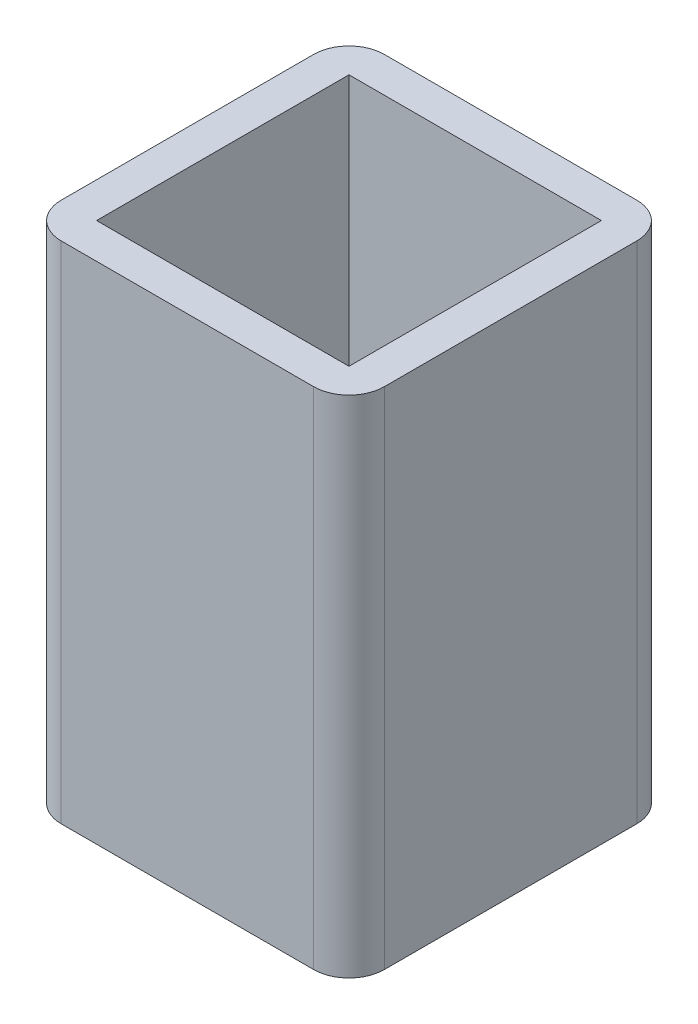
ISO-10303-21;
HEADER;
FILE_DESCRIPTION(('STEP AP214'),'2;1');
FILE_NAME('part.step','',(''),(''),'','','');
FILE_SCHEMA(('AUTOMOTIVE_DESIGN { 1 0 10303 214 1 1 1 1 }'));
ENDSEC;
DATA;
#1=APPLICATION_CONTEXT('core data for automotive mechanical design processes');
#2=APPLICATION_PROTOCOL_DEFINITION('international standard','automotive_design',2000,#1);
#3=PRODUCT_CONTEXT('',#1,'mechanical');
#4=PRODUCT('Part','Part','',(#3));
#5=PRODUCT_RELATED_PRODUCT_CATEGORY('part','',(#4));
#6=PRODUCT_DEFINITION_FORMATION('','',#4);
#7=PRODUCT_DEFINITION_CONTEXT('part definition',#1,'design');
#8=PRODUCT_DEFINITION('design','',#6,#7);
#9=PRODUCT_DEFINITION_SHAPE('','',#8);
#10=(LENGTH_UNIT() NAMED_UNIT(*) SI_UNIT(.MILLI.,.METRE.));
#11=(NAMED_UNIT(*) PLANE_ANGLE_UNIT() SI_UNIT($,.RADIAN.));
#12=(NAMED_UNIT(*) SI_UNIT($,.STERADIAN.) SOLID_ANGLE_UNIT());
#13=UNCERTAINTY_MEASURE_WITH_UNIT(LENGTH_MEASURE(1.E-05),#10,'distance_accuracy_value','');
#14=(GEOMETRIC_REPRESENTATION_CONTEXT(3) GLOBAL_UNCERTAINTY_ASSIGNED_CONTEXT((#13)) GLOBAL_UNIT_ASSIGNED_CONTEXT((#10,
#11,#12)) REPRESENTATION_CONTEXT('',''));
#15=CARTESIAN_POINT('',(0.,0.,0.));
#16=DIRECTION('',(0.,0.,1.));
#17=DIRECTION('',(1.,0.,0.));
#18=AXIS2_PLACEMENT_3D('',#15,#16,#17);
#19=CARTESIAN_POINT('',(22.8,40.,2.8));
#20=DIRECTION('',(0.,-1.,0.));
#21=DIRECTION('',(0.,0.,-1.));
#22=AXIS2_PLACEMENT_3D('',#19,#20,#21);
#23=CYLINDRICAL_SURFACE('',#22,2.8);
#24=CARTESIAN_POINT('',(22.8,0.,2.8));
#25=DIRECTION('',(0.,1.,0.));
#26=DIRECTION('',(0.,0.,-1.));
#27=AXIS2_PLACEMENT_3D('',#24,#25,#26);
#28=CIRCLE('',#27,2.8);
#29=CARTESIAN_POINT('',(25.6,0.,2.80000000000002));
#30=VERTEX_POINT('',#29);
#31=CARTESIAN_POINT('',(22.8,0.,0.));
#32=VERTEX_POINT('',#31);
#33=EDGE_CURVE('E157',#30,#32,#28,.T.);
#34=ORIENTED_EDGE('',*,*,#33,.T.);
#35=DIRECTION('',(0.,-1.,0.));
#36=VECTOR('',#35,1.);
#37=CARTESIAN_POINT('',(22.8,40.,0.));
#38=LINE('',#37,#36);
#39=CARTESIAN_POINT('',(22.8,40.,0.));
#40=VERTEX_POINT('',#39);
#41=EDGE_CURVE('E11',#40,#32,#38,.T.);
#42=ORIENTED_EDGE('',*,*,#41,.F.);
#43=CARTESIAN_POINT('',(22.8,40.,2.8));
#44=DIRECTION('',(0.,1.,0.));
#45=DIRECTION('',(0.,0.,-1.));
#46=AXIS2_PLACEMENT_3D('',#43,#44,#45);
#47=CIRCLE('',#46,2.8);
#48=CARTESIAN_POINT('',(25.6,40.,2.80000000000002));
#49=VERTEX_POINT('',#48);
#50=EDGE_CURVE('E158',#49,#40,#47,.T.);
#51=ORIENTED_EDGE('',*,*,#50,.F.);
#52=DIRECTION('',(0.,-1.,0.));
#53=VECTOR('',#52,1.);
#54=CARTESIAN_POINT('',(25.6,40.,2.80000000000002));
#55=LINE('',#54,#53);
#56=EDGE_CURVE('E176',#49,#30,#55,.T.);
#57=ORIENTED_EDGE('',*,*,#56,.T.);
#58=EDGE_LOOP('',(#34,#42,#51,#57));
#59=FACE_BOUND('',#58,.T.);
#60=ADVANCED_FACE('F32',(#59),#23,.T.);
#61=CARTESIAN_POINT('',(2.80000000000002,40.,0.));
#62=DIRECTION('',(0.,0.,1.));
#63=DIRECTION('',(1.,0.,0.));
#64=AXIS2_PLACEMENT_3D('',#61,#62,#63);
#65=PLANE('',#64);
#66=DIRECTION('',(-1.,0.,0.));
#67=VECTOR('',#66,1.);
#68=CARTESIAN_POINT('',(2.80000000000002,0.,0.));
#69=LINE('',#68,#67);
#70=CARTESIAN_POINT('',(2.80000000000002,0.,0.));
#71=VERTEX_POINT('',#70);
#72=EDGE_CURVE('E179',#32,#71,#69,.T.);
#73=ORIENTED_EDGE('',*,*,#72,.T.);
#74=DIRECTION('',(0.,-1.,0.));
#75=VECTOR('',#74,1.);
#76=CARTESIAN_POINT('',(2.80000000000002,40.,0.));
#77=LINE('',#76,#75);
#78=CARTESIAN_POINT('',(2.80000000000002,40.,0.));
#79=VERTEX_POINT('',#78);
#80=EDGE_CURVE('E39',#79,#71,#77,.T.);
#81=ORIENTED_EDGE('',*,*,#80,.F.);
#82=DIRECTION('',(-1.,0.,0.));
#83=VECTOR('',#82,1.);
#84=CARTESIAN_POINT('',(2.80000000000002,40.,0.));
#85=LINE('',#84,#83);
#86=EDGE_CURVE('E161',#40,#79,#85,.T.);
#87=ORIENTED_EDGE('',*,*,#86,.F.);
#88=ORIENTED_EDGE('',*,*,#41,.T.);
#89=EDGE_LOOP('',(#73,#81,#87,#88));
#90=FACE_BOUND('',#89,.T.);
#91=ADVANCED_FACE('F234',(#90),#65,.F.);
#92=CARTESIAN_POINT('',(2.8,40.,2.8));
#93=DIRECTION('',(0.,-1.,0.));
#94=DIRECTION('',(0.,0.,-1.));
#95=AXIS2_PLACEMENT_3D('',#92,#93,#94);
#96=CYLINDRICAL_SURFACE('',#95,2.8);
#97=CARTESIAN_POINT('',(2.8,0.,2.8));
#98=DIRECTION('',(0.,1.,0.));
#99=DIRECTION('',(0.,0.,1.));
#100=AXIS2_PLACEMENT_3D('',#97,#98,#99);
#101=CIRCLE('',#100,2.8);
#102=CARTESIAN_POINT('',(0.,0.,2.80000000000002));
#103=VERTEX_POINT('',#102);
#104=EDGE_CURVE('E181',#71,#103,#101,.T.);
#105=ORIENTED_EDGE('',*,*,#104,.T.);
#106=DIRECTION('',(0.,-1.,0.));
#107=VECTOR('',#106,1.);
#108=CARTESIAN_POINT('',(0.,40.,2.80000000000002));
#109=LINE('',#108,#107);
#110=CARTESIAN_POINT('',(0.,40.,2.80000000000002));
#111=VERTEX_POINT('',#110);
#112=EDGE_CURVE('E206',#111,#103,#109,.T.);
#113=ORIENTED_EDGE('',*,*,#112,.F.);
#114=CARTESIAN_POINT('',(2.8,40.,2.8));
#115=DIRECTION('',(0.,1.,0.));
#116=DIRECTION('',(0.,0.,1.));
#117=AXIS2_PLACEMENT_3D('',#114,#115,#116);
#118=CIRCLE('',#117,2.8);
#119=EDGE_CURVE('E164',#79,#111,#118,.T.);
#120=ORIENTED_EDGE('',*,*,#119,.F.);
#121=ORIENTED_EDGE('',*,*,#80,.T.);
#122=EDGE_LOOP('',(#105,#113,#120,#121));
#123=FACE_BOUND('',#122,.T.);
#124=ADVANCED_FACE('F213',(#123),#96,.T.);
#125=CARTESIAN_POINT('',(0.,40.,2.80000000000002));
#126=DIRECTION('',(1.,0.,0.));
#127=DIRECTION('',(0.,0.,-1.));
#128=AXIS2_PLACEMENT_3D('',#125,#126,#127);
#129=PLANE('',#128);
#130=DIRECTION('',(0.,0.,1.));
#131=VECTOR('',#130,1.);
#132=CARTESIAN_POINT('',(0.,0.,2.80000000000002));
#133=LINE('',#132,#131);
#134=CARTESIAN_POINT('',(0.,0.,22.8));
#135=VERTEX_POINT('',#134);
#136=EDGE_CURVE('E183',#103,#135,#133,.T.);
#137=ORIENTED_EDGE('',*,*,#136,.T.);
#138=DIRECTION('',(0.,-1.,0.));
#139=VECTOR('',#138,1.);
#140=CARTESIAN_POINT('',(0.,40.,22.8));
#141=LINE('',#140,#139);
#142=CARTESIAN_POINT('',(0.,40.,22.8));
#143=VERTEX_POINT('',#142);
#144=EDGE_CURVE('E203',#143,#135,#141,.T.);
#145=ORIENTED_EDGE('',*,*,#144,.F.);
#146=DIRECTION('',(0.,0.,1.));
#147=VECTOR('',#146,1.);
#148=CARTESIAN_POINT('',(0.,40.,2.80000000000002));
#149=LINE('',#148,#147);
#150=EDGE_CURVE('E166',#111,#143,#149,.T.);
#151=ORIENTED_EDGE('',*,*,#150,.F.);
#152=ORIENTED_EDGE('',*,*,#112,.T.);
#153=EDGE_LOOP('',(#137,#145,#151,#152));
#154=FACE_BOUND('',#153,.T.);
#155=ADVANCED_FACE('F222',(#154),#129,.F.);
#156=CARTESIAN_POINT('',(2.8,40.,22.8));
#157=DIRECTION('',(0.,-1.,0.));
#158=DIRECTION('',(0.,0.,-1.));
#159=AXIS2_PLACEMENT_3D('',#156,#157,#158);
#160=CYLINDRICAL_SURFACE('',#159,2.8);
#161=CARTESIAN_POINT('',(2.8,0.,22.8));
#162=DIRECTION('',(0.,1.,0.));
#163=DIRECTION('',(0.,0.,1.));
#164=AXIS2_PLACEMENT_3D('',#161,#162,#163);
#165=CIRCLE('',#164,2.8);
#166=CARTESIAN_POINT('',(2.80000000000002,0.,25.6));
#167=VERTEX_POINT('',#166);
#168=EDGE_CURVE('E185',#135,#167,#165,.T.);
#169=ORIENTED_EDGE('',*,*,#168,.T.);
#170=DIRECTION('',(0.,-1.,0.));
#171=VECTOR('',#170,1.);
#172=CARTESIAN_POINT('',(2.80000000000002,40.,25.6));
#173=LINE('',#172,#171);
#174=CARTESIAN_POINT('',(2.80000000000002,40.,25.6));
#175=VERTEX_POINT('',#174);
#176=EDGE_CURVE('E200',#175,#167,#173,.T.);
#177=ORIENTED_EDGE('',*,*,#176,.F.);
#178=CARTESIAN_POINT('',(2.8,40.,22.8));
#179=DIRECTION('',(0.,1.,0.));
#180=DIRECTION('',(0.,0.,1.));
#181=AXIS2_PLACEMENT_3D('',#178,#179,#180);
#182=CIRCLE('',#181,2.8);
#183=EDGE_CURVE('E168',#143,#175,#182,.T.);
#184=ORIENTED_EDGE('',*,*,#183,.F.);
#185=ORIENTED_EDGE('',*,*,#144,.T.);
#186=EDGE_LOOP('',(#169,#177,#184,#185));
#187=FACE_BOUND('',#186,.T.);
#188=ADVANCED_FACE('F226',(#187),#160,.T.);
#189=CARTESIAN_POINT('',(2.80000000000002,40.,25.6));
#190=DIRECTION('',(0.,0.,-1.));
#191=DIRECTION('',(-1.,0.,0.));
#192=AXIS2_PLACEMENT_3D('',#189,#190,#191);
#193=PLANE('',#192);
#194=DIRECTION('',(1.,0.,0.));
#195=VECTOR('',#194,1.);
#196=CARTESIAN_POINT('',(2.80000000000002,0.,25.6));
#197=LINE('',#196,#195);
#198=CARTESIAN_POINT('',(22.8,0.,25.6));
#199=VERTEX_POINT('',#198);
#200=EDGE_CURVE('E187',#167,#199,#197,.T.);
#201=ORIENTED_EDGE('',*,*,#200,.T.);
#202=DIRECTION('',(0.,-1.,0.));
#203=VECTOR('',#202,1.);
#204=CARTESIAN_POINT('',(22.8,40.,25.6));
#205=LINE('',#204,#203);
#206=CARTESIAN_POINT('',(22.8,40.,25.6));
#207=VERTEX_POINT('',#206);
#208=EDGE_CURVE('E197',#207,#199,#205,.T.);
#209=ORIENTED_EDGE('',*,*,#208,.F.);
#210=DIRECTION('',(1.,0.,0.));
#211=VECTOR('',#210,1.);
#212=CARTESIAN_POINT('',(2.80000000000002,40.,25.6));
#213=LINE('',#212,#211);
#214=EDGE_CURVE('E170',#175,#207,#213,.T.);
#215=ORIENTED_EDGE('',*,*,#214,.F.);
#216=ORIENTED_EDGE('',*,*,#176,.T.);
#217=EDGE_LOOP('',(#201,#209,#215,#216));
#218=FACE_BOUND('',#217,.T.);
#219=ADVANCED_FACE('F247',(#218),#193,.F.);
#220=CARTESIAN_POINT('',(22.8,40.,22.8));
#221=DIRECTION('',(0.,-1.,0.));
#222=DIRECTION('',(0.,0.,-1.));
#223=AXIS2_PLACEMENT_3D('',#220,#221,#222);
#224=CYLINDRICAL_SURFACE('',#223,2.8);
#225=CARTESIAN_POINT('',(22.8,0.,22.8));
#226=DIRECTION('',(0.,1.,0.));
#227=DIRECTION('',(0.,0.,1.));
#228=AXIS2_PLACEMENT_3D('',#225,#226,#227);
#229=CIRCLE('',#228,2.8);
#230=CARTESIAN_POINT('',(25.6,0.,22.8));
#231=VERTEX_POINT('',#230);
#232=EDGE_CURVE('E189',#199,#231,#229,.T.);
#233=ORIENTED_EDGE('',*,*,#232,.T.);
#234=DIRECTION('',(0.,-1.,0.));
#235=VECTOR('',#234,1.);
#236=CARTESIAN_POINT('',(25.6,40.,22.8));
#237=LINE('',#236,#235);
#238=CARTESIAN_POINT('',(25.6,40.,22.8));
#239=VERTEX_POINT('',#238);
#240=EDGE_CURVE('E194',#239,#231,#237,.T.);
#241=ORIENTED_EDGE('',*,*,#240,.F.);
#242=CARTESIAN_POINT('',(22.8,40.,22.8));
#243=DIRECTION('',(0.,1.,0.));
#244=DIRECTION('',(0.,0.,1.));
#245=AXIS2_PLACEMENT_3D('',#242,#243,#244);
#246=CIRCLE('',#245,2.8);
#247=EDGE_CURVE('E172',#207,#239,#246,.T.);
#248=ORIENTED_EDGE('',*,*,#247,.F.);
#249=ORIENTED_EDGE('',*,*,#208,.T.);
#250=EDGE_LOOP('',(#233,#241,#248,#249));
#251=FACE_BOUND('',#250,.T.);
#252=ADVANCED_FACE('F245',(#251),#224,.T.);
#253=CARTESIAN_POINT('',(25.6,40.,2.80000000000002));
#254=DIRECTION('',(-1.,0.,0.));
#255=DIRECTION('',(0.,0.,1.));
#256=AXIS2_PLACEMENT_3D('',#253,#254,#255);
#257=PLANE('',#256);
#258=DIRECTION('',(0.,0.,-1.));
#259=VECTOR('',#258,1.);
#260=CARTESIAN_POINT('',(25.6,0.,2.80000000000002));
#261=LINE('',#260,#259);
#262=EDGE_CURVE('E162',#231,#30,#261,.T.);
#263=ORIENTED_EDGE('',*,*,#262,.T.);
#264=ORIENTED_EDGE('',*,*,#56,.F.);
#265=DIRECTION('',(0.,0.,-1.));
#266=VECTOR('',#265,1.);
#267=CARTESIAN_POINT('',(25.6,40.,2.80000000000002));
#268=LINE('',#267,#266);
#269=EDGE_CURVE('E174',#239,#49,#268,.T.);
#270=ORIENTED_EDGE('',*,*,#269,.F.);
#271=ORIENTED_EDGE('',*,*,#240,.T.);
#272=EDGE_LOOP('',(#263,#264,#270,#271));
#273=FACE_BOUND('',#272,.T.);
#274=ADVANCED_FACE('F240',(#273),#257,.F.);
#275=CARTESIAN_POINT('',(22.8,40.,2.8));
#276=DIRECTION('',(0.,-1.,0.));
#277=DIRECTION('',(0.,0.,-1.));
#278=AXIS2_PLACEMENT_3D('',#275,#276,#277);
#279=PLANE('',#278);
#280=DIRECTION('',(1.,0.,0.));
#281=VECTOR('',#280,1.);
#282=CARTESIAN_POINT('',(22.8,40.,2.8));
#283=LINE('',#282,#281);
#284=CARTESIAN_POINT('',(2.8,40.,2.8));
#285=VERTEX_POINT('',#284);
#286=CARTESIAN_POINT('',(22.8,40.,2.8));
#287=VERTEX_POINT('',#286);
#288=EDGE_CURVE('E151',#285,#287,#283,.T.);
#289=ORIENTED_EDGE('',*,*,#288,.T.);
#290=DIRECTION('',(0.,0.,1.));
#291=VECTOR('',#290,1.);
#292=CARTESIAN_POINT('',(22.8,40.,2.8));
#293=LINE('',#292,#291);
#294=CARTESIAN_POINT('',(22.8,40.,22.8));
#295=VERTEX_POINT('',#294);
#296=EDGE_CURVE('E154',#287,#295,#293,.T.);
#297=ORIENTED_EDGE('',*,*,#296,.T.);
#298=DIRECTION('',(-1.,0.,0.));
#299=VECTOR('',#298,1.);
#300=CARTESIAN_POINT('',(22.8,40.,22.8));
#301=LINE('',#300,#299);
#302=CARTESIAN_POINT('',(2.8,40.,22.8));
#303=VERTEX_POINT('',#302);
#304=EDGE_CURVE('E146',#295,#303,#301,.T.);
#305=ORIENTED_EDGE('',*,*,#304,.T.);
#306=DIRECTION('',(0.,0.,-1.));
#307=VECTOR('',#306,1.);
#308=CARTESIAN_POINT('',(2.8,40.,2.79999999999999));
#309=LINE('',#308,#307);
#310=EDGE_CURVE('E126',#303,#285,#309,.T.);
#311=ORIENTED_EDGE('',*,*,#310,.T.);
#312=EDGE_LOOP('',(#289,#297,#305,#311));
#313=FACE_BOUND('',#312,.T.);
#314=ORIENTED_EDGE('',*,*,#50,.T.);
#315=ORIENTED_EDGE('',*,*,#86,.T.);
#316=ORIENTED_EDGE('',*,*,#119,.T.);
#317=ORIENTED_EDGE('',*,*,#150,.T.);
#318=ORIENTED_EDGE('',*,*,#183,.T.);
#319=ORIENTED_EDGE('',*,*,#214,.T.);
#320=ORIENTED_EDGE('',*,*,#247,.T.);
#321=ORIENTED_EDGE('',*,*,#269,.T.);
#322=EDGE_LOOP('',(#314,#315,#316,#317,#318,#319,#320,#321));
#323=FACE_BOUND('',#322,.T.);
#324=ADVANCED_FACE('F230',(#313,#323),#279,.F.);
#325=CARTESIAN_POINT('',(22.8,0.,2.8));
#326=DIRECTION('',(0.,-1.,0.));
#327=DIRECTION('',(0.,0.,-1.));
#328=AXIS2_PLACEMENT_3D('',#325,#326,#327);
#329=PLANE('',#328);
#330=DIRECTION('',(0.,0.,1.));
#331=VECTOR('',#330,1.);
#332=CARTESIAN_POINT('',(22.8,0.,2.8));
#333=LINE('',#332,#331);
#334=CARTESIAN_POINT('',(22.8,0.,2.8));
#335=VERTEX_POINT('',#334);
#336=CARTESIAN_POINT('',(22.8,0.,22.8));
#337=VERTEX_POINT('',#336);
#338=EDGE_CURVE('E54',#335,#337,#333,.T.);
#339=ORIENTED_EDGE('',*,*,#338,.F.);
#340=DIRECTION('',(1.,0.,0.));
#341=VECTOR('',#340,1.);
#342=CARTESIAN_POINT('',(2.8,0.,2.8));
#343=LINE('',#342,#341);
#344=CARTESIAN_POINT('',(2.8,0.,2.8));
#345=VERTEX_POINT('',#344);
#346=EDGE_CURVE('E139',#345,#335,#343,.T.);
#347=ORIENTED_EDGE('',*,*,#346,.F.);
#348=DIRECTION('',(0.,0.,-1.));
#349=VECTOR('',#348,1.);
#350=CARTESIAN_POINT('',(2.8,0.,2.8));
#351=LINE('',#350,#349);
#352=CARTESIAN_POINT('',(2.8,0.,22.8));
#353=VERTEX_POINT('',#352);
#354=EDGE_CURVE('E123',#353,#345,#351,.T.);
#355=ORIENTED_EDGE('',*,*,#354,.F.);
#356=DIRECTION('',(-1.,0.,0.));
#357=VECTOR('',#356,1.);
#358=CARTESIAN_POINT('',(2.8,0.,22.8));
#359=LINE('',#358,#357);
#360=EDGE_CURVE('E132',#337,#353,#359,.T.);
#361=ORIENTED_EDGE('',*,*,#360,.F.);
#362=EDGE_LOOP('',(#339,#347,#355,#361));
#363=FACE_BOUND('',#362,.T.);
#364=ORIENTED_EDGE('',*,*,#33,.F.);
#365=ORIENTED_EDGE('',*,*,#262,.F.);
#366=ORIENTED_EDGE('',*,*,#232,.F.);
#367=ORIENTED_EDGE('',*,*,#200,.F.);
#368=ORIENTED_EDGE('',*,*,#168,.F.);
#369=ORIENTED_EDGE('',*,*,#136,.F.);
#370=ORIENTED_EDGE('',*,*,#104,.F.);
#371=ORIENTED_EDGE('',*,*,#72,.F.);
#372=EDGE_LOOP('',(#364,#365,#366,#367,#368,#369,#370,#371));
#373=FACE_BOUND('',#372,.T.);
#374=ADVANCED_FACE('F136',(#363,#373),#329,.T.);
#375=CARTESIAN_POINT('',(22.8,1040.5,2.8));
#376=DIRECTION('',(1.,0.,0.));
#377=DIRECTION('',(0.,0.,-1.));
#378=AXIS2_PLACEMENT_3D('',#375,#376,#377);
#379=PLANE('',#378);
#380=DIRECTION('',(0.,-1.,0.));
#381=VECTOR('',#380,1.);
#382=CARTESIAN_POINT('',(22.8,1040.5,2.8));
#383=LINE('',#382,#381);
#384=EDGE_CURVE('E144',#287,#335,#383,.T.);
#385=ORIENTED_EDGE('',*,*,#384,.T.);
#386=ORIENTED_EDGE('',*,*,#338,.T.);
#387=DIRECTION('',(0.,-1.,0.));
#388=VECTOR('',#387,1.);
#389=CARTESIAN_POINT('',(22.8,1040.5,22.8));
#390=LINE('',#389,#388);
#391=EDGE_CURVE('E129',#295,#337,#390,.T.);
#392=ORIENTED_EDGE('',*,*,#391,.F.);
#393=ORIENTED_EDGE('',*,*,#296,.F.);
#394=EDGE_LOOP('',(#385,#386,#392,#393));
#395=FACE_BOUND('',#394,.T.);
#396=ADVANCED_FACE('F310',(#395),#379,.F.);
#397=CARTESIAN_POINT('',(2.8,1040.5,2.8));
#398=DIRECTION('',(0.,0.,-1.));
#399=DIRECTION('',(-1.,0.,0.));
#400=AXIS2_PLACEMENT_3D('',#397,#398,#399);
#401=PLANE('',#400);
#402=DIRECTION('',(0.,-1.,0.));
#403=VECTOR('',#402,1.);
#404=CARTESIAN_POINT('',(2.8,1040.5,2.8));
#405=LINE('',#404,#403);
#406=EDGE_CURVE('E128',#285,#345,#405,.T.);
#407=ORIENTED_EDGE('',*,*,#406,.T.);
#408=ORIENTED_EDGE('',*,*,#346,.T.);
#409=ORIENTED_EDGE('',*,*,#384,.F.);
#410=ORIENTED_EDGE('',*,*,#288,.F.);
#411=EDGE_LOOP('',(#407,#408,#409,#410));
#412=FACE_BOUND('',#411,.T.);
#413=ADVANCED_FACE('F319',(#412),#401,.F.);
#414=CARTESIAN_POINT('',(2.8,1040.5,2.8));
#415=DIRECTION('',(-1.,0.,0.));
#416=DIRECTION('',(0.,0.,1.));
#417=AXIS2_PLACEMENT_3D('',#414,#415,#416);
#418=PLANE('',#417);
#419=DIRECTION('',(0.,-1.,0.));
#420=VECTOR('',#419,1.);
#421=CARTESIAN_POINT('',(2.8,1040.5,22.8));
#422=LINE('',#421,#420);
#423=EDGE_CURVE('E46',#303,#353,#422,.T.);
#424=ORIENTED_EDGE('',*,*,#423,.T.);
#425=ORIENTED_EDGE('',*,*,#354,.T.);
#426=ORIENTED_EDGE('',*,*,#406,.F.);
#427=ORIENTED_EDGE('',*,*,#310,.F.);
#428=EDGE_LOOP('',(#424,#425,#426,#427));
#429=FACE_BOUND('',#428,.T.);
#430=ADVANCED_FACE('F120',(#429),#418,.F.);
#431=CARTESIAN_POINT('',(2.8,1040.5,22.8));
#432=DIRECTION('',(0.,0.,1.));
#433=DIRECTION('',(1.,0.,0.));
#434=AXIS2_PLACEMENT_3D('',#431,#432,#433);
#435=PLANE('',#434);
#436=ORIENTED_EDGE('',*,*,#391,.T.);
#437=ORIENTED_EDGE('',*,*,#360,.T.);
#438=ORIENTED_EDGE('',*,*,#423,.F.);
#439=ORIENTED_EDGE('',*,*,#304,.F.);
#440=EDGE_LOOP('',(#436,#437,#438,#439));
#441=FACE_BOUND('',#440,.T.);
#442=ADVANCED_FACE('F133',(#441),#435,.F.);
#443=CLOSED_SHELL('',(#60,#91,#124,#155,#188,#219,#252,#274,#324,#374,#396,#413,#430,#442));
#444=MANIFOLD_SOLID_BREP('B2',#443);
#445=ADVANCED_BREP_SHAPE_REPRESENTATION('',(#18,#444),#14);
#446=SHAPE_DEFINITION_REPRESENTATION(#9,#445);
ENDSEC;
END-ISO-10303-21;
